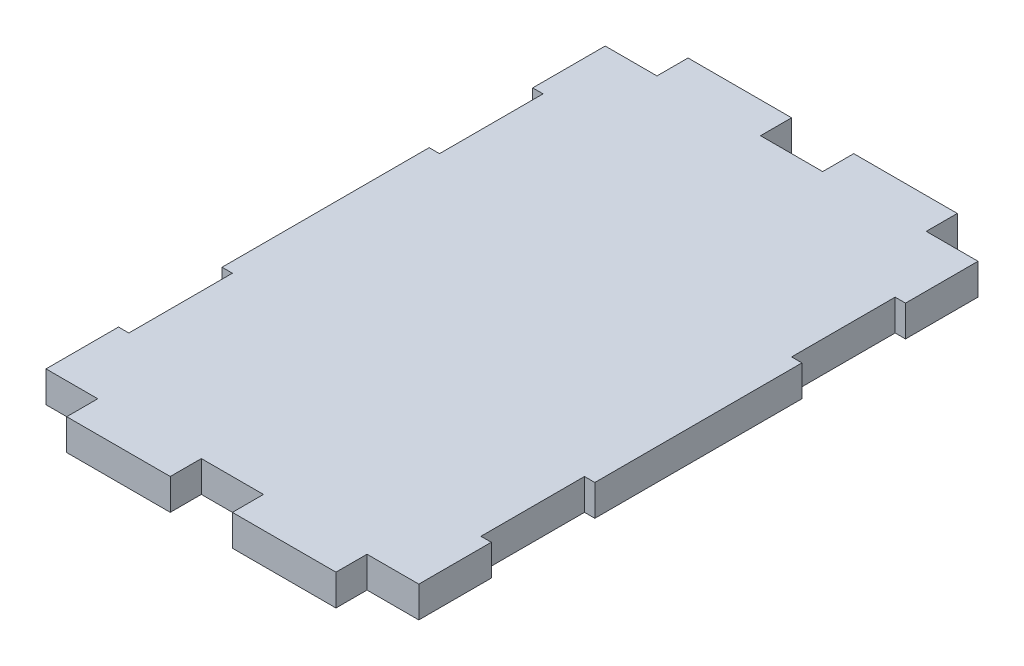
ISO-10303-21;
HEADER;
FILE_DESCRIPTION(('STEP AP214'),'2;1');
FILE_NAME('part.step','',(''),(''),'','','');
FILE_SCHEMA(('AUTOMOTIVE_DESIGN { 1 0 10303 214 1 1 1 1 }'));
ENDSEC;
DATA;
#1=APPLICATION_CONTEXT('core data for automotive mechanical design processes');
#2=APPLICATION_PROTOCOL_DEFINITION('international standard','automotive_design',2000,#1);
#3=PRODUCT_CONTEXT('',#1,'mechanical');
#4=PRODUCT('Part','Part','',(#3));
#5=PRODUCT_RELATED_PRODUCT_CATEGORY('part','',(#4));
#6=PRODUCT_DEFINITION_FORMATION('','',#4);
#7=PRODUCT_DEFINITION_CONTEXT('part definition',#1,'design');
#8=PRODUCT_DEFINITION('design','',#6,#7);
#9=PRODUCT_DEFINITION_SHAPE('','',#8);
#10=(LENGTH_UNIT() NAMED_UNIT(*) SI_UNIT(.MILLI.,.METRE.));
#11=(NAMED_UNIT(*) PLANE_ANGLE_UNIT() SI_UNIT($,.RADIAN.));
#12=(NAMED_UNIT(*) SI_UNIT($,.STERADIAN.) SOLID_ANGLE_UNIT());
#13=UNCERTAINTY_MEASURE_WITH_UNIT(LENGTH_MEASURE(1.E-05),#10,'distance_accuracy_value','');
#14=(GEOMETRIC_REPRESENTATION_CONTEXT(3) GLOBAL_UNCERTAINTY_ASSIGNED_CONTEXT((#13)) GLOBAL_UNIT_ASSIGNED_CONTEXT((#10,
#11,#12)) REPRESENTATION_CONTEXT('',''));
#15=CARTESIAN_POINT('',(0.,0.,0.));
#16=DIRECTION('',(0.,0.,1.));
#17=DIRECTION('',(1.,0.,0.));
#18=AXIS2_PLACEMENT_3D('',#15,#16,#17);
#19=CARTESIAN_POINT('',(0.,3.,-3.));
#20=DIRECTION('',(0.,0.,-1.));
#21=DIRECTION('',(-1.,0.,0.));
#22=AXIS2_PLACEMENT_3D('',#19,#20,#21);
#23=PLANE('',#22);
#24=DIRECTION('',(1.,0.,0.));
#25=VECTOR('',#24,1.);
#26=CARTESIAN_POINT('',(0.,0.,-3.));
#27=LINE('',#26,#25);
#28=CARTESIAN_POINT('',(0.,0.,-3.));
#29=VERTEX_POINT('',#28);
#30=CARTESIAN_POINT('',(5.,0.,-3.));
#31=VERTEX_POINT('',#30);
#32=EDGE_CURVE('E302',#29,#31,#27,.T.);
#33=ORIENTED_EDGE('',*,*,#32,.T.);
#34=DIRECTION('',(0.,-1.,0.));
#35=VECTOR('',#34,1.);
#36=CARTESIAN_POINT('',(5.,3.,-3.));
#37=LINE('',#36,#35);
#38=CARTESIAN_POINT('',(5.,3.,-3.));
#39=VERTEX_POINT('',#38);
#40=EDGE_CURVE('E11',#39,#31,#37,.T.);
#41=ORIENTED_EDGE('',*,*,#40,.F.);
#42=DIRECTION('',(1.,0.,0.));
#43=VECTOR('',#42,1.);
#44=CARTESIAN_POINT('',(0.,3.,-3.));
#45=LINE('',#44,#43);
#46=CARTESIAN_POINT('',(0.,3.,-3.));
#47=VERTEX_POINT('',#46);
#48=EDGE_CURVE('E391',#47,#39,#45,.T.);
#49=ORIENTED_EDGE('',*,*,#48,.F.);
#50=DIRECTION('',(0.,-1.,0.));
#51=VECTOR('',#50,1.);
#52=CARTESIAN_POINT('',(0.,3.,-3.));
#53=LINE('',#52,#51);
#54=EDGE_CURVE('E52',#47,#29,#53,.T.);
#55=ORIENTED_EDGE('',*,*,#54,.T.);
#56=EDGE_LOOP('',(#33,#41,#49,#55));
#57=FACE_BOUND('',#56,.T.);
#58=ADVANCED_FACE('F35',(#57),#23,.F.);
#59=CARTESIAN_POINT('',(5.,3.,0.));
#60=DIRECTION('',(1.,0.,0.));
#61=DIRECTION('',(0.,0.,-1.));
#62=AXIS2_PLACEMENT_3D('',#59,#60,#61);
#63=PLANE('',#62);
#64=DIRECTION('',(0.,0.,1.));
#65=VECTOR('',#64,1.);
#66=CARTESIAN_POINT('',(5.,0.,0.));
#67=LINE('',#66,#65);
#68=CARTESIAN_POINT('',(5.,0.,0.));
#69=VERTEX_POINT('',#68);
#70=EDGE_CURVE('E304',#31,#69,#67,.T.);
#71=ORIENTED_EDGE('',*,*,#70,.T.);
#72=DIRECTION('',(0.,-1.,0.));
#73=VECTOR('',#72,1.);
#74=CARTESIAN_POINT('',(5.,3.,0.));
#75=LINE('',#74,#73);
#76=CARTESIAN_POINT('',(5.,3.,0.));
#77=VERTEX_POINT('',#76);
#78=EDGE_CURVE('E44',#77,#69,#75,.T.);
#79=ORIENTED_EDGE('',*,*,#78,.F.);
#80=DIRECTION('',(0.,0.,1.));
#81=VECTOR('',#80,1.);
#82=CARTESIAN_POINT('',(5.,3.,0.));
#83=LINE('',#82,#81);
#84=EDGE_CURVE('E174',#39,#77,#83,.T.);
#85=ORIENTED_EDGE('',*,*,#84,.F.);
#86=ORIENTED_EDGE('',*,*,#40,.T.);
#87=EDGE_LOOP('',(#71,#79,#85,#86));
#88=FACE_BOUND('',#87,.T.);
#89=ADVANCED_FACE('F37',(#88),#63,.F.);
#90=CARTESIAN_POINT('',(0.,3.,0.));
#91=DIRECTION('',(0.,0.,-1.));
#92=DIRECTION('',(-1.,0.,0.));
#93=AXIS2_PLACEMENT_3D('',#90,#91,#92);
#94=PLANE('',#93);
#95=DIRECTION('',(1.,0.,0.));
#96=VECTOR('',#95,1.);
#97=CARTESIAN_POINT('',(0.,0.,0.));
#98=LINE('',#97,#96);
#99=CARTESIAN_POINT('',(15.,0.,0.));
#100=VERTEX_POINT('',#99);
#101=EDGE_CURVE('E307',#69,#100,#98,.T.);
#102=ORIENTED_EDGE('',*,*,#101,.T.);
#103=DIRECTION('',(0.,-1.,0.));
#104=VECTOR('',#103,1.);
#105=CARTESIAN_POINT('',(15.,3.,0.));
#106=LINE('',#105,#104);
#107=CARTESIAN_POINT('',(15.,3.,0.));
#108=VERTEX_POINT('',#107);
#109=EDGE_CURVE('E459',#108,#100,#106,.T.);
#110=ORIENTED_EDGE('',*,*,#109,.F.);
#111=DIRECTION('',(1.,0.,0.));
#112=VECTOR('',#111,1.);
#113=CARTESIAN_POINT('',(0.,3.,0.));
#114=LINE('',#113,#112);
#115=EDGE_CURVE('E466',#77,#108,#114,.T.);
#116=ORIENTED_EDGE('',*,*,#115,.F.);
#117=ORIENTED_EDGE('',*,*,#78,.T.);
#118=EDGE_LOOP('',(#102,#110,#116,#117));
#119=FACE_BOUND('',#118,.T.);
#120=ADVANCED_FACE('F464',(#119),#94,.F.);
#121=CARTESIAN_POINT('',(15.,3.,0.));
#122=DIRECTION('',(1.,0.,0.));
#123=DIRECTION('',(0.,0.,-1.));
#124=AXIS2_PLACEMENT_3D('',#121,#122,#123);
#125=PLANE('',#124);
#126=DIRECTION('',(0.,0.,1.));
#127=VECTOR('',#126,1.);
#128=CARTESIAN_POINT('',(15.,0.,0.));
#129=LINE('',#128,#127);
#130=CARTESIAN_POINT('',(15.,0.,-3.));
#131=VERTEX_POINT('',#130);
#132=EDGE_CURVE('E310',#131,#100,#129,.T.);
#133=ORIENTED_EDGE('',*,*,#132,.F.);
#134=DIRECTION('',(0.,-1.,0.));
#135=VECTOR('',#134,1.);
#136=CARTESIAN_POINT('',(15.,3.,-3.));
#137=LINE('',#136,#135);
#138=CARTESIAN_POINT('',(15.,3.,-3.));
#139=VERTEX_POINT('',#138);
#140=EDGE_CURVE('E457',#139,#131,#137,.T.);
#141=ORIENTED_EDGE('',*,*,#140,.F.);
#142=DIRECTION('',(0.,0.,1.));
#143=VECTOR('',#142,1.);
#144=CARTESIAN_POINT('',(15.,3.,0.));
#145=LINE('',#144,#143);
#146=EDGE_CURVE('E477',#139,#108,#145,.T.);
#147=ORIENTED_EDGE('',*,*,#146,.T.);
#148=ORIENTED_EDGE('',*,*,#109,.T.);
#149=EDGE_LOOP('',(#133,#141,#147,#148));
#150=FACE_BOUND('',#149,.T.);
#151=ADVANCED_FACE('F473',(#150),#125,.T.);
#152=CARTESIAN_POINT('',(21.,0.,-3.));
#153=VERTEX_POINT('',#152);
#154=EDGE_CURVE('E305',#131,#153,#27,.T.);
#155=ORIENTED_EDGE('',*,*,#154,.T.);
#156=DIRECTION('',(0.,-1.,0.));
#157=VECTOR('',#156,1.);
#158=CARTESIAN_POINT('',(21.,3.,-3.));
#159=LINE('',#158,#157);
#160=CARTESIAN_POINT('',(21.,3.,-3.));
#161=VERTEX_POINT('',#160);
#162=EDGE_CURVE('E454',#161,#153,#159,.T.);
#163=ORIENTED_EDGE('',*,*,#162,.F.);
#164=EDGE_CURVE('E478',#139,#161,#45,.T.);
#165=ORIENTED_EDGE('',*,*,#164,.F.);
#166=ORIENTED_EDGE('',*,*,#140,.T.);
#167=EDGE_LOOP('',(#155,#163,#165,#166));
#168=FACE_BOUND('',#167,.T.);
#169=ADVANCED_FACE('F566',(#168),#23,.F.);
#170=CARTESIAN_POINT('',(21.,3.,0.));
#171=DIRECTION('',(1.,0.,0.));
#172=DIRECTION('',(0.,0.,-1.));
#173=AXIS2_PLACEMENT_3D('',#170,#171,#172);
#174=PLANE('',#173);
#175=DIRECTION('',(0.,0.,1.));
#176=VECTOR('',#175,1.);
#177=CARTESIAN_POINT('',(21.,0.,0.));
#178=LINE('',#177,#176);
#179=CARTESIAN_POINT('',(21.,0.,0.));
#180=VERTEX_POINT('',#179);
#181=EDGE_CURVE('E313',#153,#180,#178,.T.);
#182=ORIENTED_EDGE('',*,*,#181,.T.);
#183=DIRECTION('',(0.,-1.,0.));
#184=VECTOR('',#183,1.);
#185=CARTESIAN_POINT('',(21.,3.,0.));
#186=LINE('',#185,#184);
#187=CARTESIAN_POINT('',(21.,3.,0.));
#188=VERTEX_POINT('',#187);
#189=EDGE_CURVE('E451',#188,#180,#186,.T.);
#190=ORIENTED_EDGE('',*,*,#189,.F.);
#191=DIRECTION('',(0.,0.,1.));
#192=VECTOR('',#191,1.);
#193=CARTESIAN_POINT('',(21.,3.,0.));
#194=LINE('',#193,#192);
#195=EDGE_CURVE('E480',#161,#188,#194,.T.);
#196=ORIENTED_EDGE('',*,*,#195,.F.);
#197=ORIENTED_EDGE('',*,*,#162,.T.);
#198=EDGE_LOOP('',(#182,#190,#196,#197));
#199=FACE_BOUND('',#198,.T.);
#200=ADVANCED_FACE('F573',(#199),#174,.F.);
#201=CARTESIAN_POINT('',(0.,3.,0.));
#202=DIRECTION('',(0.,0.,-1.));
#203=DIRECTION('',(-1.,0.,0.));
#204=AXIS2_PLACEMENT_3D('',#201,#202,#203);
#205=PLANE('',#204);
#206=DIRECTION('',(1.,0.,0.));
#207=VECTOR('',#206,1.);
#208=CARTESIAN_POINT('',(0.,0.,0.));
#209=LINE('',#208,#207);
#210=CARTESIAN_POINT('',(31.,0.,0.));
#211=VERTEX_POINT('',#210);
#212=EDGE_CURVE('E315',#180,#211,#209,.T.);
#213=ORIENTED_EDGE('',*,*,#212,.T.);
#214=DIRECTION('',(0.,-1.,0.));
#215=VECTOR('',#214,1.);
#216=CARTESIAN_POINT('',(31.,3.,0.));
#217=LINE('',#216,#215);
#218=CARTESIAN_POINT('',(31.,3.,0.));
#219=VERTEX_POINT('',#218);
#220=EDGE_CURVE('E449',#219,#211,#217,.T.);
#221=ORIENTED_EDGE('',*,*,#220,.F.);
#222=DIRECTION('',(1.,0.,0.));
#223=VECTOR('',#222,1.);
#224=CARTESIAN_POINT('',(0.,3.,0.));
#225=LINE('',#224,#223);
#226=EDGE_CURVE('E486',#188,#219,#225,.T.);
#227=ORIENTED_EDGE('',*,*,#226,.F.);
#228=ORIENTED_EDGE('',*,*,#189,.T.);
#229=EDGE_LOOP('',(#213,#221,#227,#228));
#230=FACE_BOUND('',#229,.T.);
#231=ADVANCED_FACE('F579',(#230),#205,.F.);
#232=CARTESIAN_POINT('',(31.,3.,0.));
#233=DIRECTION('',(1.,0.,0.));
#234=DIRECTION('',(0.,0.,-1.));
#235=AXIS2_PLACEMENT_3D('',#232,#233,#234);
#236=PLANE('',#235);
#237=DIRECTION('',(0.,0.,1.));
#238=VECTOR('',#237,1.);
#239=CARTESIAN_POINT('',(31.,0.,0.));
#240=LINE('',#239,#238);
#241=CARTESIAN_POINT('',(31.,0.,-3.));
#242=VERTEX_POINT('',#241);
#243=EDGE_CURVE('E318',#242,#211,#240,.T.);
#244=ORIENTED_EDGE('',*,*,#243,.F.);
#245=DIRECTION('',(0.,-1.,0.));
#246=VECTOR('',#245,1.);
#247=CARTESIAN_POINT('',(31.,3.,-3.));
#248=LINE('',#247,#246);
#249=CARTESIAN_POINT('',(31.,3.,-3.));
#250=VERTEX_POINT('',#249);
#251=EDGE_CURVE('E447',#250,#242,#248,.T.);
#252=ORIENTED_EDGE('',*,*,#251,.F.);
#253=DIRECTION('',(0.,0.,1.));
#254=VECTOR('',#253,1.);
#255=CARTESIAN_POINT('',(31.,3.,0.));
#256=LINE('',#255,#254);
#257=EDGE_CURVE('E488',#250,#219,#256,.T.);
#258=ORIENTED_EDGE('',*,*,#257,.T.);
#259=ORIENTED_EDGE('',*,*,#220,.T.);
#260=EDGE_LOOP('',(#244,#252,#258,#259));
#261=FACE_BOUND('',#260,.T.);
#262=ADVANCED_FACE('F743',(#261),#236,.T.);
#263=CARTESIAN_POINT('',(0.,3.,-3.));
#264=DIRECTION('',(0.,0.,1.));
#265=DIRECTION('',(1.,0.,0.));
#266=AXIS2_PLACEMENT_3D('',#263,#264,#265);
#267=PLANE('',#266);
#268=DIRECTION('',(-1.,0.,0.));
#269=VECTOR('',#268,1.);
#270=CARTESIAN_POINT('',(0.,0.,-3.));
#271=LINE('',#270,#269);
#272=CARTESIAN_POINT('',(36.,0.,-3.));
#273=VERTEX_POINT('',#272);
#274=EDGE_CURVE('E321',#273,#242,#271,.T.);
#275=ORIENTED_EDGE('',*,*,#274,.F.);
#276=DIRECTION('',(0.,-1.,0.));
#277=VECTOR('',#276,1.);
#278=CARTESIAN_POINT('',(36.,3.,-3.));
#279=LINE('',#278,#277);
#280=CARTESIAN_POINT('',(36.,3.,-3.));
#281=VERTEX_POINT('',#280);
#282=EDGE_CURVE('E445',#281,#273,#279,.T.);
#283=ORIENTED_EDGE('',*,*,#282,.F.);
#284=DIRECTION('',(-1.,0.,0.));
#285=VECTOR('',#284,1.);
#286=CARTESIAN_POINT('',(0.,3.,-3.));
#287=LINE('',#286,#285);
#288=EDGE_CURVE('E491',#281,#250,#287,.T.);
#289=ORIENTED_EDGE('',*,*,#288,.T.);
#290=ORIENTED_EDGE('',*,*,#251,.T.);
#291=EDGE_LOOP('',(#275,#283,#289,#290));
#292=FACE_BOUND('',#291,.T.);
#293=ADVANCED_FACE('F594',(#292),#267,.T.);
#294=CARTESIAN_POINT('',(36.,3.,0.));
#295=DIRECTION('',(-1.,0.,0.));
#296=DIRECTION('',(0.,0.,1.));
#297=AXIS2_PLACEMENT_3D('',#294,#295,#296);
#298=PLANE('',#297);
#299=DIRECTION('',(0.,0.,-1.));
#300=VECTOR('',#299,1.);
#301=CARTESIAN_POINT('',(36.,0.,0.));
#302=LINE('',#301,#300);
#303=CARTESIAN_POINT('',(36.,0.,-10.));
#304=VERTEX_POINT('',#303);
#305=EDGE_CURVE('E324',#273,#304,#302,.T.);
#306=ORIENTED_EDGE('',*,*,#305,.T.);
#307=DIRECTION('',(0.,-1.,0.));
#308=VECTOR('',#307,1.);
#309=CARTESIAN_POINT('',(36.,3.,-10.));
#310=LINE('',#309,#308);
#311=CARTESIAN_POINT('',(36.,3.,-10.));
#312=VERTEX_POINT('',#311);
#313=EDGE_CURVE('E442',#312,#304,#310,.T.);
#314=ORIENTED_EDGE('',*,*,#313,.F.);
#315=DIRECTION('',(0.,0.,-1.));
#316=VECTOR('',#315,1.);
#317=CARTESIAN_POINT('',(36.,3.,0.));
#318=LINE('',#317,#316);
#319=EDGE_CURVE('E494',#281,#312,#318,.T.);
#320=ORIENTED_EDGE('',*,*,#319,.F.);
#321=ORIENTED_EDGE('',*,*,#282,.T.);
#322=EDGE_LOOP('',(#306,#314,#320,#321));
#323=FACE_BOUND('',#322,.T.);
#324=ADVANCED_FACE('F599',(#323),#298,.F.);
#325=CARTESIAN_POINT('',(0.,3.,-10.));
#326=DIRECTION('',(0.,0.,1.));
#327=DIRECTION('',(1.,0.,0.));
#328=AXIS2_PLACEMENT_3D('',#325,#326,#327);
#329=PLANE('',#328);
#330=DIRECTION('',(-1.,0.,0.));
#331=VECTOR('',#330,1.);
#332=CARTESIAN_POINT('',(0.,0.,-10.));
#333=LINE('',#332,#331);
#334=CARTESIAN_POINT('',(35.,0.,-10.));
#335=VERTEX_POINT('',#334);
#336=EDGE_CURVE('E326',#304,#335,#333,.T.);
#337=ORIENTED_EDGE('',*,*,#336,.T.);
#338=DIRECTION('',(0.,-1.,0.));
#339=VECTOR('',#338,1.);
#340=CARTESIAN_POINT('',(35.,3.,-10.));
#341=LINE('',#340,#339);
#342=CARTESIAN_POINT('',(35.,3.,-10.));
#343=VERTEX_POINT('',#342);
#344=EDGE_CURVE('E439',#343,#335,#341,.T.);
#345=ORIENTED_EDGE('',*,*,#344,.F.);
#346=DIRECTION('',(-1.,0.,0.));
#347=VECTOR('',#346,1.);
#348=CARTESIAN_POINT('',(0.,3.,-10.));
#349=LINE('',#348,#347);
#350=EDGE_CURVE('E496',#312,#343,#349,.T.);
#351=ORIENTED_EDGE('',*,*,#350,.F.);
#352=ORIENTED_EDGE('',*,*,#313,.T.);
#353=EDGE_LOOP('',(#337,#345,#351,#352));
#354=FACE_BOUND('',#353,.T.);
#355=ADVANCED_FACE('F606',(#354),#329,.F.);
#356=CARTESIAN_POINT('',(35.,3.,0.));
#357=DIRECTION('',(-1.,0.,0.));
#358=DIRECTION('',(0.,0.,1.));
#359=AXIS2_PLACEMENT_3D('',#356,#357,#358);
#360=PLANE('',#359);
#361=DIRECTION('',(0.,0.,-1.));
#362=VECTOR('',#361,1.);
#363=CARTESIAN_POINT('',(35.,0.,0.));
#364=LINE('',#363,#362);
#365=CARTESIAN_POINT('',(35.,0.,-20.));
#366=VERTEX_POINT('',#365);
#367=EDGE_CURVE('E328',#335,#366,#364,.T.);
#368=ORIENTED_EDGE('',*,*,#367,.T.);
#369=DIRECTION('',(0.,-1.,0.));
#370=VECTOR('',#369,1.);
#371=CARTESIAN_POINT('',(35.,3.,-20.));
#372=LINE('',#371,#370);
#373=CARTESIAN_POINT('',(35.,3.,-20.));
#374=VERTEX_POINT('',#373);
#375=EDGE_CURVE('E437',#374,#366,#372,.T.);
#376=ORIENTED_EDGE('',*,*,#375,.F.);
#377=DIRECTION('',(0.,0.,-1.));
#378=VECTOR('',#377,1.);
#379=CARTESIAN_POINT('',(35.,3.,0.));
#380=LINE('',#379,#378);
#381=EDGE_CURVE('E498',#343,#374,#380,.T.);
#382=ORIENTED_EDGE('',*,*,#381,.F.);
#383=ORIENTED_EDGE('',*,*,#344,.T.);
#384=EDGE_LOOP('',(#368,#376,#382,#383));
#385=FACE_BOUND('',#384,.T.);
#386=ADVANCED_FACE('F610',(#385),#360,.F.);
#387=CARTESIAN_POINT('',(0.,3.,-20.));
#388=DIRECTION('',(0.,0.,1.));
#389=DIRECTION('',(1.,0.,0.));
#390=AXIS2_PLACEMENT_3D('',#387,#388,#389);
#391=PLANE('',#390);
#392=DIRECTION('',(-1.,0.,0.));
#393=VECTOR('',#392,1.);
#394=CARTESIAN_POINT('',(0.,0.,-20.));
#395=LINE('',#394,#393);
#396=CARTESIAN_POINT('',(36.,0.,-20.));
#397=VERTEX_POINT('',#396);
#398=EDGE_CURVE('E331',#397,#366,#395,.T.);
#399=ORIENTED_EDGE('',*,*,#398,.F.);
#400=DIRECTION('',(0.,-1.,0.));
#401=VECTOR('',#400,1.);
#402=CARTESIAN_POINT('',(36.,3.,-20.));
#403=LINE('',#402,#401);
#404=CARTESIAN_POINT('',(36.,3.,-20.));
#405=VERTEX_POINT('',#404);
#406=EDGE_CURVE('E435',#405,#397,#403,.T.);
#407=ORIENTED_EDGE('',*,*,#406,.F.);
#408=DIRECTION('',(-1.,0.,0.));
#409=VECTOR('',#408,1.);
#410=CARTESIAN_POINT('',(0.,3.,-20.));
#411=LINE('',#410,#409);
#412=EDGE_CURVE('E500',#405,#374,#411,.T.);
#413=ORIENTED_EDGE('',*,*,#412,.T.);
#414=ORIENTED_EDGE('',*,*,#375,.T.);
#415=EDGE_LOOP('',(#399,#407,#413,#414));
#416=FACE_BOUND('',#415,.T.);
#417=ADVANCED_FACE('F613',(#416),#391,.T.);
#418=CARTESIAN_POINT('',(36.,3.,0.));
#419=DIRECTION('',(1.,0.,0.));
#420=DIRECTION('',(0.,0.,-1.));
#421=AXIS2_PLACEMENT_3D('',#418,#419,#420);
#422=PLANE('',#421);
#423=DIRECTION('',(0.,0.,1.));
#424=VECTOR('',#423,1.);
#425=CARTESIAN_POINT('',(36.,0.,0.));
#426=LINE('',#425,#424);
#427=CARTESIAN_POINT('',(36.,0.,-40.));
#428=VERTEX_POINT('',#427);
#429=EDGE_CURVE('E335',#428,#397,#426,.T.);
#430=ORIENTED_EDGE('',*,*,#429,.F.);
#431=DIRECTION('',(0.,-1.,0.));
#432=VECTOR('',#431,1.);
#433=CARTESIAN_POINT('',(36.,3.,-40.));
#434=LINE('',#433,#432);
#435=CARTESIAN_POINT('',(36.,3.,-40.));
#436=VERTEX_POINT('',#435);
#437=EDGE_CURVE('E433',#436,#428,#434,.T.);
#438=ORIENTED_EDGE('',*,*,#437,.F.);
#439=DIRECTION('',(0.,0.,1.));
#440=VECTOR('',#439,1.);
#441=CARTESIAN_POINT('',(36.,3.,0.));
#442=LINE('',#441,#440);
#443=EDGE_CURVE('E504',#436,#405,#442,.T.);
#444=ORIENTED_EDGE('',*,*,#443,.T.);
#445=ORIENTED_EDGE('',*,*,#406,.T.);
#446=EDGE_LOOP('',(#430,#438,#444,#445));
#447=FACE_BOUND('',#446,.T.);
#448=ADVANCED_FACE('F617',(#447),#422,.T.);
#449=CARTESIAN_POINT('',(0.,3.,-40.));
#450=DIRECTION('',(0.,0.,1.));
#451=DIRECTION('',(1.,0.,0.));
#452=AXIS2_PLACEMENT_3D('',#449,#450,#451);
#453=PLANE('',#452);
#454=DIRECTION('',(-1.,0.,0.));
#455=VECTOR('',#454,1.);
#456=CARTESIAN_POINT('',(0.,0.,-40.));
#457=LINE('',#456,#455);
#458=CARTESIAN_POINT('',(35.,0.,-40.));
#459=VERTEX_POINT('',#458);
#460=EDGE_CURVE('E338',#428,#459,#457,.T.);
#461=ORIENTED_EDGE('',*,*,#460,.T.);
#462=DIRECTION('',(0.,-1.,0.));
#463=VECTOR('',#462,1.);
#464=CARTESIAN_POINT('',(35.,3.,-40.));
#465=LINE('',#464,#463);
#466=CARTESIAN_POINT('',(35.,3.,-40.));
#467=VERTEX_POINT('',#466);
#468=EDGE_CURVE('E430',#467,#459,#465,.T.);
#469=ORIENTED_EDGE('',*,*,#468,.F.);
#470=DIRECTION('',(-1.,0.,0.));
#471=VECTOR('',#470,1.);
#472=CARTESIAN_POINT('',(0.,3.,-40.));
#473=LINE('',#472,#471);
#474=EDGE_CURVE('E507',#436,#467,#473,.T.);
#475=ORIENTED_EDGE('',*,*,#474,.F.);
#476=ORIENTED_EDGE('',*,*,#437,.T.);
#477=EDGE_LOOP('',(#461,#469,#475,#476));
#478=FACE_BOUND('',#477,.T.);
#479=ADVANCED_FACE('F622',(#478),#453,.F.);
#480=CARTESIAN_POINT('',(35.,0.,-50.));
#481=VERTEX_POINT('',#480);
#482=EDGE_CURVE('E332',#459,#481,#364,.T.);
#483=ORIENTED_EDGE('',*,*,#482,.T.);
#484=DIRECTION('',(0.,-1.,0.));
#485=VECTOR('',#484,1.);
#486=CARTESIAN_POINT('',(35.,3.,-50.));
#487=LINE('',#486,#485);
#488=CARTESIAN_POINT('',(35.,3.,-50.));
#489=VERTEX_POINT('',#488);
#490=EDGE_CURVE('E428',#489,#481,#487,.T.);
#491=ORIENTED_EDGE('',*,*,#490,.F.);
#492=EDGE_CURVE('E501',#467,#489,#380,.T.);
#493=ORIENTED_EDGE('',*,*,#492,.F.);
#494=ORIENTED_EDGE('',*,*,#468,.T.);
#495=EDGE_LOOP('',(#483,#491,#493,#494));
#496=FACE_BOUND('',#495,.T.);
#497=ADVANCED_FACE('F628',(#496),#360,.F.);
#498=CARTESIAN_POINT('',(0.,3.,-50.));
#499=DIRECTION('',(0.,0.,1.));
#500=DIRECTION('',(1.,0.,0.));
#501=AXIS2_PLACEMENT_3D('',#498,#499,#500);
#502=PLANE('',#501);
#503=DIRECTION('',(-1.,0.,0.));
#504=VECTOR('',#503,1.);
#505=CARTESIAN_POINT('',(0.,0.,-50.));
#506=LINE('',#505,#504);
#507=CARTESIAN_POINT('',(36.,0.,-50.));
#508=VERTEX_POINT('',#507);
#509=EDGE_CURVE('E340',#508,#481,#506,.T.);
#510=ORIENTED_EDGE('',*,*,#509,.F.);
#511=DIRECTION('',(0.,-1.,0.));
#512=VECTOR('',#511,1.);
#513=CARTESIAN_POINT('',(36.,3.,-50.));
#514=LINE('',#513,#512);
#515=CARTESIAN_POINT('',(36.,3.,-50.));
#516=VERTEX_POINT('',#515);
#517=EDGE_CURVE('E426',#516,#508,#514,.T.);
#518=ORIENTED_EDGE('',*,*,#517,.F.);
#519=DIRECTION('',(-1.,0.,0.));
#520=VECTOR('',#519,1.);
#521=CARTESIAN_POINT('',(0.,3.,-50.));
#522=LINE('',#521,#520);
#523=EDGE_CURVE('E509',#516,#489,#522,.T.);
#524=ORIENTED_EDGE('',*,*,#523,.T.);
#525=ORIENTED_EDGE('',*,*,#490,.T.);
#526=EDGE_LOOP('',(#510,#518,#524,#525));
#527=FACE_BOUND('',#526,.T.);
#528=ADVANCED_FACE('F632',(#527),#502,.T.);
#529=CARTESIAN_POINT('',(36.,3.,0.));
#530=DIRECTION('',(-1.,0.,0.));
#531=DIRECTION('',(0.,0.,1.));
#532=AXIS2_PLACEMENT_3D('',#529,#530,#531);
#533=PLANE('',#532);
#534=DIRECTION('',(0.,0.,-1.));
#535=VECTOR('',#534,1.);
#536=CARTESIAN_POINT('',(36.,0.,0.));
#537=LINE('',#536,#535);
#538=CARTESIAN_POINT('',(36.,0.,-57.));
#539=VERTEX_POINT('',#538);
#540=EDGE_CURVE('E343',#508,#539,#537,.T.);
#541=ORIENTED_EDGE('',*,*,#540,.T.);
#542=DIRECTION('',(0.,-1.,0.));
#543=VECTOR('',#542,1.);
#544=CARTESIAN_POINT('',(36.,3.,-57.));
#545=LINE('',#544,#543);
#546=CARTESIAN_POINT('',(36.,3.,-57.));
#547=VERTEX_POINT('',#546);
#548=EDGE_CURVE('E424',#547,#539,#545,.T.);
#549=ORIENTED_EDGE('',*,*,#548,.F.);
#550=DIRECTION('',(0.,0.,-1.));
#551=VECTOR('',#550,1.);
#552=CARTESIAN_POINT('',(36.,3.,0.));
#553=LINE('',#552,#551);
#554=EDGE_CURVE('E512',#516,#547,#553,.T.);
#555=ORIENTED_EDGE('',*,*,#554,.F.);
#556=ORIENTED_EDGE('',*,*,#517,.T.);
#557=EDGE_LOOP('',(#541,#549,#555,#556));
#558=FACE_BOUND('',#557,.T.);
#559=ADVANCED_FACE('F637',(#558),#533,.F.);
#560=CARTESIAN_POINT('',(0.,3.,-57.));
#561=DIRECTION('',(0.,0.,-1.));
#562=DIRECTION('',(-1.,0.,0.));
#563=AXIS2_PLACEMENT_3D('',#560,#561,#562);
#564=PLANE('',#563);
#565=DIRECTION('',(1.,0.,0.));
#566=VECTOR('',#565,1.);
#567=CARTESIAN_POINT('',(0.,0.,-57.));
#568=LINE('',#567,#566);
#569=CARTESIAN_POINT('',(31.,0.,-57.));
#570=VERTEX_POINT('',#569);
#571=EDGE_CURVE('E346',#570,#539,#568,.T.);
#572=ORIENTED_EDGE('',*,*,#571,.F.);
#573=DIRECTION('',(0.,-1.,0.));
#574=VECTOR('',#573,1.);
#575=CARTESIAN_POINT('',(31.,3.,-57.));
#576=LINE('',#575,#574);
#577=CARTESIAN_POINT('',(31.,3.,-57.));
#578=VERTEX_POINT('',#577);
#579=EDGE_CURVE('E422',#578,#570,#576,.T.);
#580=ORIENTED_EDGE('',*,*,#579,.F.);
#581=DIRECTION('',(1.,0.,0.));
#582=VECTOR('',#581,1.);
#583=CARTESIAN_POINT('',(0.,3.,-57.));
#584=LINE('',#583,#582);
#585=EDGE_CURVE('E514',#578,#547,#584,.T.);
#586=ORIENTED_EDGE('',*,*,#585,.T.);
#587=ORIENTED_EDGE('',*,*,#548,.T.);
#588=EDGE_LOOP('',(#572,#580,#586,#587));
#589=FACE_BOUND('',#588,.T.);
#590=ADVANCED_FACE('F644',(#589),#564,.T.);
#591=CARTESIAN_POINT('',(31.,3.,0.));
#592=DIRECTION('',(-1.,0.,0.));
#593=DIRECTION('',(0.,0.,1.));
#594=AXIS2_PLACEMENT_3D('',#591,#592,#593);
#595=PLANE('',#594);
#596=DIRECTION('',(0.,0.,-1.));
#597=VECTOR('',#596,1.);
#598=CARTESIAN_POINT('',(31.,0.,0.));
#599=LINE('',#598,#597);
#600=CARTESIAN_POINT('',(31.,0.,-60.));
#601=VERTEX_POINT('',#600);
#602=EDGE_CURVE('E349',#570,#601,#599,.T.);
#603=ORIENTED_EDGE('',*,*,#602,.T.);
#604=DIRECTION('',(0.,-1.,0.));
#605=VECTOR('',#604,1.);
#606=CARTESIAN_POINT('',(31.,3.,-60.));
#607=LINE('',#606,#605);
#608=CARTESIAN_POINT('',(31.,3.,-60.));
#609=VERTEX_POINT('',#608);
#610=EDGE_CURVE('E420',#609,#601,#607,.T.);
#611=ORIENTED_EDGE('',*,*,#610,.F.);
#612=DIRECTION('',(0.,0.,-1.));
#613=VECTOR('',#612,1.);
#614=CARTESIAN_POINT('',(31.,3.,0.));
#615=LINE('',#614,#613);
#616=EDGE_CURVE('E517',#578,#609,#615,.T.);
#617=ORIENTED_EDGE('',*,*,#616,.F.);
#618=ORIENTED_EDGE('',*,*,#579,.T.);
#619=EDGE_LOOP('',(#603,#611,#617,#618));
#620=FACE_BOUND('',#619,.T.);
#621=ADVANCED_FACE('F647',(#620),#595,.F.);
#622=CARTESIAN_POINT('',(0.,3.,-60.));
#623=DIRECTION('',(0.,0.,-1.));
#624=DIRECTION('',(-1.,0.,0.));
#625=AXIS2_PLACEMENT_3D('',#622,#623,#624);
#626=PLANE('',#625);
#627=DIRECTION('',(1.,0.,0.));
#628=VECTOR('',#627,1.);
#629=CARTESIAN_POINT('',(0.,0.,-60.));
#630=LINE('',#629,#628);
#631=CARTESIAN_POINT('',(21.,0.,-60.));
#632=VERTEX_POINT('',#631);
#633=EDGE_CURVE('E354',#632,#601,#630,.T.);
#634=ORIENTED_EDGE('',*,*,#633,.F.);
#635=DIRECTION('',(0.,-1.,0.));
#636=VECTOR('',#635,1.);
#637=CARTESIAN_POINT('',(21.,3.,-60.));
#638=LINE('',#637,#636);
#639=CARTESIAN_POINT('',(21.,3.,-60.));
#640=VERTEX_POINT('',#639);
#641=EDGE_CURVE('E418',#640,#632,#638,.T.);
#642=ORIENTED_EDGE('',*,*,#641,.F.);
#643=DIRECTION('',(1.,0.,0.));
#644=VECTOR('',#643,1.);
#645=CARTESIAN_POINT('',(0.,3.,-60.));
#646=LINE('',#645,#644);
#647=EDGE_CURVE('E521',#640,#609,#646,.T.);
#648=ORIENTED_EDGE('',*,*,#647,.T.);
#649=ORIENTED_EDGE('',*,*,#610,.T.);
#650=EDGE_LOOP('',(#634,#642,#648,#649));
#651=FACE_BOUND('',#650,.T.);
#652=ADVANCED_FACE('F650',(#651),#626,.T.);
#653=CARTESIAN_POINT('',(21.,3.,0.));
#654=DIRECTION('',(-1.,0.,0.));
#655=DIRECTION('',(0.,0.,1.));
#656=AXIS2_PLACEMENT_3D('',#653,#654,#655);
#657=PLANE('',#656);
#658=DIRECTION('',(0.,0.,-1.));
#659=VECTOR('',#658,1.);
#660=CARTESIAN_POINT('',(21.,0.,0.));
#661=LINE('',#660,#659);
#662=CARTESIAN_POINT('',(21.,0.,-57.));
#663=VERTEX_POINT('',#662);
#664=EDGE_CURVE('E357',#663,#632,#661,.T.);
#665=ORIENTED_EDGE('',*,*,#664,.F.);
#666=DIRECTION('',(0.,-1.,0.));
#667=VECTOR('',#666,1.);
#668=CARTESIAN_POINT('',(21.,3.,-57.));
#669=LINE('',#668,#667);
#670=CARTESIAN_POINT('',(21.,3.,-57.));
#671=VERTEX_POINT('',#670);
#672=EDGE_CURVE('E416',#671,#663,#669,.T.);
#673=ORIENTED_EDGE('',*,*,#672,.F.);
#674=DIRECTION('',(0.,0.,-1.));
#675=VECTOR('',#674,1.);
#676=CARTESIAN_POINT('',(21.,3.,0.));
#677=LINE('',#676,#675);
#678=EDGE_CURVE('E524',#671,#640,#677,.T.);
#679=ORIENTED_EDGE('',*,*,#678,.T.);
#680=ORIENTED_EDGE('',*,*,#641,.T.);
#681=EDGE_LOOP('',(#665,#673,#679,#680));
#682=FACE_BOUND('',#681,.T.);
#683=ADVANCED_FACE('F656',(#682),#657,.T.);
#684=CARTESIAN_POINT('',(15.,0.,-57.));
#685=VERTEX_POINT('',#684);
#686=EDGE_CURVE('E351',#685,#663,#568,.T.);
#687=ORIENTED_EDGE('',*,*,#686,.F.);
#688=DIRECTION('',(0.,-1.,0.));
#689=VECTOR('',#688,1.);
#690=CARTESIAN_POINT('',(15.,3.,-57.));
#691=LINE('',#690,#689);
#692=CARTESIAN_POINT('',(15.,3.,-57.));
#693=VERTEX_POINT('',#692);
#694=EDGE_CURVE('E414',#693,#685,#691,.T.);
#695=ORIENTED_EDGE('',*,*,#694,.F.);
#696=EDGE_CURVE('E519',#693,#671,#584,.T.);
#697=ORIENTED_EDGE('',*,*,#696,.T.);
#698=ORIENTED_EDGE('',*,*,#672,.T.);
#699=EDGE_LOOP('',(#687,#695,#697,#698));
#700=FACE_BOUND('',#699,.T.);
#701=ADVANCED_FACE('F660',(#700),#564,.T.);
#702=CARTESIAN_POINT('',(15.,3.,0.));
#703=DIRECTION('',(-1.,0.,0.));
#704=DIRECTION('',(0.,0.,1.));
#705=AXIS2_PLACEMENT_3D('',#702,#703,#704);
#706=PLANE('',#705);
#707=DIRECTION('',(0.,0.,-1.));
#708=VECTOR('',#707,1.);
#709=CARTESIAN_POINT('',(15.,0.,0.));
#710=LINE('',#709,#708);
#711=CARTESIAN_POINT('',(15.,0.,-60.));
#712=VERTEX_POINT('',#711);
#713=EDGE_CURVE('E360',#685,#712,#710,.T.);
#714=ORIENTED_EDGE('',*,*,#713,.T.);
#715=DIRECTION('',(0.,-1.,0.));
#716=VECTOR('',#715,1.);
#717=CARTESIAN_POINT('',(15.,3.,-60.));
#718=LINE('',#717,#716);
#719=CARTESIAN_POINT('',(15.,3.,-60.));
#720=VERTEX_POINT('',#719);
#721=EDGE_CURVE('E412',#720,#712,#718,.T.);
#722=ORIENTED_EDGE('',*,*,#721,.F.);
#723=DIRECTION('',(0.,0.,-1.));
#724=VECTOR('',#723,1.);
#725=CARTESIAN_POINT('',(15.,3.,0.));
#726=LINE('',#725,#724);
#727=EDGE_CURVE('E527',#693,#720,#726,.T.);
#728=ORIENTED_EDGE('',*,*,#727,.F.);
#729=ORIENTED_EDGE('',*,*,#694,.T.);
#730=EDGE_LOOP('',(#714,#722,#728,#729));
#731=FACE_BOUND('',#730,.T.);
#732=ADVANCED_FACE('F714',(#731),#706,.F.);
#733=CARTESIAN_POINT('',(0.,3.,-60.));
#734=DIRECTION('',(0.,0.,-1.));
#735=DIRECTION('',(-1.,0.,0.));
#736=AXIS2_PLACEMENT_3D('',#733,#734,#735);
#737=PLANE('',#736);
#738=DIRECTION('',(1.,0.,0.));
#739=VECTOR('',#738,1.);
#740=CARTESIAN_POINT('',(0.,0.,-60.));
#741=LINE('',#740,#739);
#742=CARTESIAN_POINT('',(5.,0.,-60.));
#743=VERTEX_POINT('',#742);
#744=EDGE_CURVE('E363',#743,#712,#741,.T.);
#745=ORIENTED_EDGE('',*,*,#744,.F.);
#746=DIRECTION('',(0.,-1.,0.));
#747=VECTOR('',#746,1.);
#748=CARTESIAN_POINT('',(5.,3.,-60.));
#749=LINE('',#748,#747);
#750=CARTESIAN_POINT('',(5.,3.,-60.));
#751=VERTEX_POINT('',#750);
#752=EDGE_CURVE('E410',#751,#743,#749,.T.);
#753=ORIENTED_EDGE('',*,*,#752,.F.);
#754=DIRECTION('',(1.,0.,0.));
#755=VECTOR('',#754,1.);
#756=CARTESIAN_POINT('',(0.,3.,-60.));
#757=LINE('',#756,#755);
#758=EDGE_CURVE('E529',#751,#720,#757,.T.);
#759=ORIENTED_EDGE('',*,*,#758,.T.);
#760=ORIENTED_EDGE('',*,*,#721,.T.);
#761=EDGE_LOOP('',(#745,#753,#759,#760));
#762=FACE_BOUND('',#761,.T.);
#763=ADVANCED_FACE('F710',(#762),#737,.T.);
#764=CARTESIAN_POINT('',(4.99999999999998,3.,0.));
#765=DIRECTION('',(-1.,0.,0.));
#766=DIRECTION('',(0.,0.,1.));
#767=AXIS2_PLACEMENT_3D('',#764,#765,#766);
#768=PLANE('',#767);
#769=DIRECTION('',(0.,0.,-1.));
#770=VECTOR('',#769,1.);
#771=CARTESIAN_POINT('',(4.99999999999998,0.,0.));
#772=LINE('',#771,#770);
#773=CARTESIAN_POINT('',(5.,0.,-57.));
#774=VERTEX_POINT('',#773);
#775=EDGE_CURVE('E366',#774,#743,#772,.T.);
#776=ORIENTED_EDGE('',*,*,#775,.F.);
#777=DIRECTION('',(0.,-1.,0.));
#778=VECTOR('',#777,1.);
#779=CARTESIAN_POINT('',(5.,3.,-57.));
#780=LINE('',#779,#778);
#781=CARTESIAN_POINT('',(5.,3.,-57.));
#782=VERTEX_POINT('',#781);
#783=EDGE_CURVE('E408',#782,#774,#780,.T.);
#784=ORIENTED_EDGE('',*,*,#783,.F.);
#785=DIRECTION('',(0.,0.,-1.));
#786=VECTOR('',#785,1.);
#787=CARTESIAN_POINT('',(4.99999999999998,3.,0.));
#788=LINE('',#787,#786);
#789=EDGE_CURVE('E532',#782,#751,#788,.T.);
#790=ORIENTED_EDGE('',*,*,#789,.T.);
#791=ORIENTED_EDGE('',*,*,#752,.T.);
#792=EDGE_LOOP('',(#776,#784,#790,#791));
#793=FACE_BOUND('',#792,.T.);
#794=ADVANCED_FACE('F707',(#793),#768,.T.);
#795=CARTESIAN_POINT('',(0.,0.,-57.));
#796=VERTEX_POINT('',#795);
#797=EDGE_CURVE('E350',#796,#774,#568,.T.);
#798=ORIENTED_EDGE('',*,*,#797,.F.);
#799=DIRECTION('',(0.,-1.,0.));
#800=VECTOR('',#799,1.);
#801=CARTESIAN_POINT('',(0.,3.,-57.));
#802=LINE('',#801,#800);
#803=CARTESIAN_POINT('',(0.,3.,-57.));
#804=VERTEX_POINT('',#803);
#805=EDGE_CURVE('E406',#804,#796,#802,.T.);
#806=ORIENTED_EDGE('',*,*,#805,.F.);
#807=EDGE_CURVE('E518',#804,#782,#584,.T.);
#808=ORIENTED_EDGE('',*,*,#807,.T.);
#809=ORIENTED_EDGE('',*,*,#783,.T.);
#810=EDGE_LOOP('',(#798,#806,#808,#809));
#811=FACE_BOUND('',#810,.T.);
#812=ADVANCED_FACE('F666',(#811),#564,.T.);
#813=CARTESIAN_POINT('',(0.,3.,0.));
#814=DIRECTION('',(-1.,0.,0.));
#815=DIRECTION('',(0.,0.,1.));
#816=AXIS2_PLACEMENT_3D('',#813,#814,#815);
#817=PLANE('',#816);
#818=DIRECTION('',(0.,0.,-1.));
#819=VECTOR('',#818,1.);
#820=CARTESIAN_POINT('',(0.,0.,0.));
#821=LINE('',#820,#819);
#822=CARTESIAN_POINT('',(0.,0.,-50.));
#823=VERTEX_POINT('',#822);
#824=EDGE_CURVE('E369',#823,#796,#821,.T.);
#825=ORIENTED_EDGE('',*,*,#824,.F.);
#826=DIRECTION('',(0.,-1.,0.));
#827=VECTOR('',#826,1.);
#828=CARTESIAN_POINT('',(0.,3.,-50.));
#829=LINE('',#828,#827);
#830=CARTESIAN_POINT('',(0.,3.,-50.));
#831=VERTEX_POINT('',#830);
#832=EDGE_CURVE('E404',#831,#823,#829,.T.);
#833=ORIENTED_EDGE('',*,*,#832,.F.);
#834=DIRECTION('',(0.,0.,-1.));
#835=VECTOR('',#834,1.);
#836=CARTESIAN_POINT('',(0.,3.,0.));
#837=LINE('',#836,#835);
#838=EDGE_CURVE('E535',#831,#804,#837,.T.);
#839=ORIENTED_EDGE('',*,*,#838,.T.);
#840=ORIENTED_EDGE('',*,*,#805,.T.);
#841=EDGE_LOOP('',(#825,#833,#839,#840));
#842=FACE_BOUND('',#841,.T.);
#843=ADVANCED_FACE('F673',(#842),#817,.T.);
#844=CARTESIAN_POINT('',(0.,3.,-50.));
#845=DIRECTION('',(0.,0.,-1.));
#846=DIRECTION('',(-1.,0.,0.));
#847=AXIS2_PLACEMENT_3D('',#844,#845,#846);
#848=PLANE('',#847);
#849=DIRECTION('',(1.,0.,0.));
#850=VECTOR('',#849,1.);
#851=CARTESIAN_POINT('',(0.,0.,-50.));
#852=LINE('',#851,#850);
#853=CARTESIAN_POINT('',(1.,0.,-50.));
#854=VERTEX_POINT('',#853);
#855=EDGE_CURVE('E372',#823,#854,#852,.T.);
#856=ORIENTED_EDGE('',*,*,#855,.T.);
#857=DIRECTION('',(0.,-1.,0.));
#858=VECTOR('',#857,1.);
#859=CARTESIAN_POINT('',(1.,3.,-50.));
#860=LINE('',#859,#858);
#861=CARTESIAN_POINT('',(1.,3.,-50.));
#862=VERTEX_POINT('',#861);
#863=EDGE_CURVE('E402',#862,#854,#860,.T.);
#864=ORIENTED_EDGE('',*,*,#863,.F.);
#865=DIRECTION('',(1.,0.,0.));
#866=VECTOR('',#865,1.);
#867=CARTESIAN_POINT('',(0.,3.,-50.));
#868=LINE('',#867,#866);
#869=EDGE_CURVE('E538',#831,#862,#868,.T.);
#870=ORIENTED_EDGE('',*,*,#869,.F.);
#871=ORIENTED_EDGE('',*,*,#832,.T.);
#872=EDGE_LOOP('',(#856,#864,#870,#871));
#873=FACE_BOUND('',#872,.T.);
#874=ADVANCED_FACE('F678',(#873),#848,.F.);
#875=CARTESIAN_POINT('',(1.,3.,0.));
#876=DIRECTION('',(-1.,0.,0.));
#877=DIRECTION('',(0.,0.,1.));
#878=AXIS2_PLACEMENT_3D('',#875,#876,#877);
#879=PLANE('',#878);
#880=DIRECTION('',(0.,0.,-1.));
#881=VECTOR('',#880,1.);
#882=CARTESIAN_POINT('',(1.,0.,0.));
#883=LINE('',#882,#881);
#884=CARTESIAN_POINT('',(1.,0.,-40.));
#885=VERTEX_POINT('',#884);
#886=EDGE_CURVE('E375',#885,#854,#883,.T.);
#887=ORIENTED_EDGE('',*,*,#886,.F.);
#888=DIRECTION('',(0.,-1.,0.));
#889=VECTOR('',#888,1.);
#890=CARTESIAN_POINT('',(1.,3.,-40.));
#891=LINE('',#890,#889);
#892=CARTESIAN_POINT('',(1.,3.,-40.));
#893=VERTEX_POINT('',#892);
#894=EDGE_CURVE('E400',#893,#885,#891,.T.);
#895=ORIENTED_EDGE('',*,*,#894,.F.);
#896=DIRECTION('',(0.,0.,-1.));
#897=VECTOR('',#896,1.);
#898=CARTESIAN_POINT('',(1.,3.,0.));
#899=LINE('',#898,#897);
#900=EDGE_CURVE('E294',#893,#862,#899,.T.);
#901=ORIENTED_EDGE('',*,*,#900,.T.);
#902=ORIENTED_EDGE('',*,*,#863,.T.);
#903=EDGE_LOOP('',(#887,#895,#901,#902));
#904=FACE_BOUND('',#903,.T.);
#905=ADVANCED_FACE('F684',(#904),#879,.T.);
#906=CARTESIAN_POINT('',(0.,3.,-40.));
#907=DIRECTION('',(0.,0.,-1.));
#908=DIRECTION('',(-1.,0.,0.));
#909=AXIS2_PLACEMENT_3D('',#906,#907,#908);
#910=PLANE('',#909);
#911=DIRECTION('',(1.,0.,0.));
#912=VECTOR('',#911,1.);
#913=CARTESIAN_POINT('',(0.,0.,-40.));
#914=LINE('',#913,#912);
#915=CARTESIAN_POINT('',(0.,0.,-40.));
#916=VERTEX_POINT('',#915);
#917=EDGE_CURVE('E378',#916,#885,#914,.T.);
#918=ORIENTED_EDGE('',*,*,#917,.F.);
#919=DIRECTION('',(0.,-1.,0.));
#920=VECTOR('',#919,1.);
#921=CARTESIAN_POINT('',(0.,3.,-40.));
#922=LINE('',#921,#920);
#923=CARTESIAN_POINT('',(0.,3.,-40.));
#924=VERTEX_POINT('',#923);
#925=EDGE_CURVE('E398',#924,#916,#922,.T.);
#926=ORIENTED_EDGE('',*,*,#925,.F.);
#927=DIRECTION('',(1.,0.,0.));
#928=VECTOR('',#927,1.);
#929=CARTESIAN_POINT('',(0.,3.,-40.));
#930=LINE('',#929,#928);
#931=EDGE_CURVE('E541',#924,#893,#930,.T.);
#932=ORIENTED_EDGE('',*,*,#931,.T.);
#933=ORIENTED_EDGE('',*,*,#894,.T.);
#934=EDGE_LOOP('',(#918,#926,#932,#933));
#935=FACE_BOUND('',#934,.T.);
#936=ADVANCED_FACE('F682',(#935),#910,.T.);
#937=CARTESIAN_POINT('',(0.,3.,0.));
#938=DIRECTION('',(1.,0.,0.));
#939=DIRECTION('',(0.,0.,-1.));
#940=AXIS2_PLACEMENT_3D('',#937,#938,#939);
#941=PLANE('',#940);
#942=DIRECTION('',(0.,0.,1.));
#943=VECTOR('',#942,1.);
#944=CARTESIAN_POINT('',(0.,0.,0.));
#945=LINE('',#944,#943);
#946=CARTESIAN_POINT('',(0.,0.,-20.));
#947=VERTEX_POINT('',#946);
#948=EDGE_CURVE('E381',#916,#947,#945,.T.);
#949=ORIENTED_EDGE('',*,*,#948,.T.);
#950=DIRECTION('',(0.,-1.,0.));
#951=VECTOR('',#950,1.);
#952=CARTESIAN_POINT('',(0.,3.,-20.));
#953=LINE('',#952,#951);
#954=CARTESIAN_POINT('',(0.,3.,-20.));
#955=VERTEX_POINT('',#954);
#956=EDGE_CURVE('E395',#955,#947,#953,.T.);
#957=ORIENTED_EDGE('',*,*,#956,.F.);
#958=DIRECTION('',(0.,0.,1.));
#959=VECTOR('',#958,1.);
#960=CARTESIAN_POINT('',(0.,3.,0.));
#961=LINE('',#960,#959);
#962=EDGE_CURVE('E543',#924,#955,#961,.T.);
#963=ORIENTED_EDGE('',*,*,#962,.F.);
#964=ORIENTED_EDGE('',*,*,#925,.T.);
#965=EDGE_LOOP('',(#949,#957,#963,#964));
#966=FACE_BOUND('',#965,.T.);
#967=ADVANCED_FACE('F549',(#966),#941,.F.);
#968=CARTESIAN_POINT('',(0.,3.,-20.));
#969=DIRECTION('',(0.,0.,-1.));
#970=DIRECTION('',(-1.,0.,0.));
#971=AXIS2_PLACEMENT_3D('',#968,#969,#970);
#972=PLANE('',#971);
#973=DIRECTION('',(1.,0.,0.));
#974=VECTOR('',#973,1.);
#975=CARTESIAN_POINT('',(0.,0.,-20.));
#976=LINE('',#975,#974);
#977=CARTESIAN_POINT('',(1.,0.,-20.));
#978=VERTEX_POINT('',#977);
#979=EDGE_CURVE('E383',#947,#978,#976,.T.);
#980=ORIENTED_EDGE('',*,*,#979,.T.);
#981=DIRECTION('',(0.,-1.,0.));
#982=VECTOR('',#981,1.);
#983=CARTESIAN_POINT('',(1.,3.,-20.));
#984=LINE('',#983,#982);
#985=CARTESIAN_POINT('',(1.,3.,-20.));
#986=VERTEX_POINT('',#985);
#987=EDGE_CURVE('E283',#986,#978,#984,.T.);
#988=ORIENTED_EDGE('',*,*,#987,.F.);
#989=DIRECTION('',(1.,0.,0.));
#990=VECTOR('',#989,1.);
#991=CARTESIAN_POINT('',(0.,3.,-20.));
#992=LINE('',#991,#990);
#993=EDGE_CURVE('E291',#955,#986,#992,.T.);
#994=ORIENTED_EDGE('',*,*,#993,.F.);
#995=ORIENTED_EDGE('',*,*,#956,.T.);
#996=EDGE_LOOP('',(#980,#988,#994,#995));
#997=FACE_BOUND('',#996,.T.);
#998=ADVANCED_FACE('F553',(#997),#972,.F.);
#999=CARTESIAN_POINT('',(1.,0.,-10.));
#1000=VERTEX_POINT('',#999);
#1001=EDGE_CURVE('E279',#1000,#978,#883,.T.);
#1002=ORIENTED_EDGE('',*,*,#1001,.F.);
#1003=DIRECTION('',(0.,-1.,0.));
#1004=VECTOR('',#1003,1.);
#1005=CARTESIAN_POINT('',(1.,3.,-10.));
#1006=LINE('',#1005,#1004);
#1007=CARTESIAN_POINT('',(1.,3.,-10.));
#1008=VERTEX_POINT('',#1007);
#1009=EDGE_CURVE('E274',#1008,#1000,#1006,.T.);
#1010=ORIENTED_EDGE('',*,*,#1009,.F.);
#1011=EDGE_CURVE('E277',#1008,#986,#899,.T.);
#1012=ORIENTED_EDGE('',*,*,#1011,.T.);
#1013=ORIENTED_EDGE('',*,*,#987,.T.);
#1014=EDGE_LOOP('',(#1002,#1010,#1012,#1013));
#1015=FACE_BOUND('',#1014,.T.);
#1016=ADVANCED_FACE('F276',(#1015),#879,.T.);
#1017=CARTESIAN_POINT('',(0.,3.,-10.));
#1018=DIRECTION('',(0.,0.,-1.));
#1019=DIRECTION('',(-1.,0.,0.));
#1020=AXIS2_PLACEMENT_3D('',#1017,#1018,#1019);
#1021=PLANE('',#1020);
#1022=DIRECTION('',(1.,0.,0.));
#1023=VECTOR('',#1022,1.);
#1024=CARTESIAN_POINT('',(0.,0.,-10.));
#1025=LINE('',#1024,#1023);
#1026=CARTESIAN_POINT('',(0.,0.,-10.));
#1027=VERTEX_POINT('',#1026);
#1028=EDGE_CURVE('E386',#1027,#1000,#1025,.T.);
#1029=ORIENTED_EDGE('',*,*,#1028,.F.);
#1030=DIRECTION('',(0.,-1.,0.));
#1031=VECTOR('',#1030,1.);
#1032=CARTESIAN_POINT('',(0.,3.,-10.));
#1033=LINE('',#1032,#1031);
#1034=CARTESIAN_POINT('',(0.,3.,-10.));
#1035=VERTEX_POINT('',#1034);
#1036=EDGE_CURVE('E162',#1035,#1027,#1033,.T.);
#1037=ORIENTED_EDGE('',*,*,#1036,.F.);
#1038=DIRECTION('',(1.,0.,0.));
#1039=VECTOR('',#1038,1.);
#1040=CARTESIAN_POINT('',(0.,3.,-10.));
#1041=LINE('',#1040,#1039);
#1042=EDGE_CURVE('E289',#1035,#1008,#1041,.T.);
#1043=ORIENTED_EDGE('',*,*,#1042,.T.);
#1044=ORIENTED_EDGE('',*,*,#1009,.T.);
#1045=EDGE_LOOP('',(#1029,#1037,#1043,#1044));
#1046=FACE_BOUND('',#1045,.T.);
#1047=ADVANCED_FACE('F295',(#1046),#1021,.T.);
#1048=CARTESIAN_POINT('',(0.,3.,0.));
#1049=DIRECTION('',(-1.,0.,0.));
#1050=DIRECTION('',(0.,0.,1.));
#1051=AXIS2_PLACEMENT_3D('',#1048,#1049,#1050);
#1052=PLANE('',#1051);
#1053=DIRECTION('',(0.,0.,-1.));
#1054=VECTOR('',#1053,1.);
#1055=CARTESIAN_POINT('',(0.,0.,0.));
#1056=LINE('',#1055,#1054);
#1057=EDGE_CURVE('E388',#29,#1027,#1056,.T.);
#1058=ORIENTED_EDGE('',*,*,#1057,.F.);
#1059=ORIENTED_EDGE('',*,*,#54,.F.);
#1060=DIRECTION('',(0.,0.,-1.));
#1061=VECTOR('',#1060,1.);
#1062=CARTESIAN_POINT('',(0.,3.,0.));
#1063=LINE('',#1062,#1061);
#1064=EDGE_CURVE('E296',#47,#1035,#1063,.T.);
#1065=ORIENTED_EDGE('',*,*,#1064,.T.);
#1066=ORIENTED_EDGE('',*,*,#1036,.T.);
#1067=EDGE_LOOP('',(#1058,#1059,#1065,#1066));
#1068=FACE_BOUND('',#1067,.T.);
#1069=ADVANCED_FACE('F554',(#1068),#1052,.T.);
#1070=CARTESIAN_POINT('',(0.,3.,0.));
#1071=DIRECTION('',(0.,1.,0.));
#1072=DIRECTION('',(0.,0.,1.));
#1073=AXIS2_PLACEMENT_3D('',#1070,#1071,#1072);
#1074=PLANE('',#1073);
#1075=ORIENTED_EDGE('',*,*,#48,.T.);
#1076=ORIENTED_EDGE('',*,*,#84,.T.);
#1077=ORIENTED_EDGE('',*,*,#115,.T.);
#1078=ORIENTED_EDGE('',*,*,#146,.F.);
#1079=ORIENTED_EDGE('',*,*,#164,.T.);
#1080=ORIENTED_EDGE('',*,*,#195,.T.);
#1081=ORIENTED_EDGE('',*,*,#226,.T.);
#1082=ORIENTED_EDGE('',*,*,#257,.F.);
#1083=ORIENTED_EDGE('',*,*,#288,.F.);
#1084=ORIENTED_EDGE('',*,*,#319,.T.);
#1085=ORIENTED_EDGE('',*,*,#350,.T.);
#1086=ORIENTED_EDGE('',*,*,#381,.T.);
#1087=ORIENTED_EDGE('',*,*,#412,.F.);
#1088=ORIENTED_EDGE('',*,*,#443,.F.);
#1089=ORIENTED_EDGE('',*,*,#474,.T.);
#1090=ORIENTED_EDGE('',*,*,#492,.T.);
#1091=ORIENTED_EDGE('',*,*,#523,.F.);
#1092=ORIENTED_EDGE('',*,*,#554,.T.);
#1093=ORIENTED_EDGE('',*,*,#585,.F.);
#1094=ORIENTED_EDGE('',*,*,#616,.T.);
#1095=ORIENTED_EDGE('',*,*,#647,.F.);
#1096=ORIENTED_EDGE('',*,*,#678,.F.);
#1097=ORIENTED_EDGE('',*,*,#696,.F.);
#1098=ORIENTED_EDGE('',*,*,#727,.T.);
#1099=ORIENTED_EDGE('',*,*,#758,.F.);
#1100=ORIENTED_EDGE('',*,*,#789,.F.);
#1101=ORIENTED_EDGE('',*,*,#807,.F.);
#1102=ORIENTED_EDGE('',*,*,#838,.F.);
#1103=ORIENTED_EDGE('',*,*,#869,.T.);
#1104=ORIENTED_EDGE('',*,*,#900,.F.);
#1105=ORIENTED_EDGE('',*,*,#931,.F.);
#1106=ORIENTED_EDGE('',*,*,#962,.T.);
#1107=ORIENTED_EDGE('',*,*,#993,.T.);
#1108=ORIENTED_EDGE('',*,*,#1011,.F.);
#1109=ORIENTED_EDGE('',*,*,#1042,.F.);
#1110=ORIENTED_EDGE('',*,*,#1064,.F.);
#1111=EDGE_LOOP('',(#1075,#1076,#1077,#1078,#1079,#1080,#1081,#1082,#1083,#1084,#1085,#1086,
#1087,#1088,#1089,#1090,#1091,#1092,#1093,#1094,#1095,#1096,#1097,#1098,#1099,#1100,#1101,#1102,
#1103,#1104,#1105,#1106,#1107,#1108,#1109,#1110));
#1112=FACE_BOUND('',#1111,.T.);
#1113=ADVANCED_FACE('F287',(#1112),#1074,.T.);
#1114=CARTESIAN_POINT('',(0.,0.,0.));
#1115=DIRECTION('',(0.,1.,0.));
#1116=DIRECTION('',(0.,0.,1.));
#1117=AXIS2_PLACEMENT_3D('',#1114,#1115,#1116);
#1118=PLANE('',#1117);
#1119=ORIENTED_EDGE('',*,*,#32,.F.);
#1120=ORIENTED_EDGE('',*,*,#1057,.T.);
#1121=ORIENTED_EDGE('',*,*,#1028,.T.);
#1122=ORIENTED_EDGE('',*,*,#1001,.T.);
#1123=ORIENTED_EDGE('',*,*,#979,.F.);
#1124=ORIENTED_EDGE('',*,*,#948,.F.);
#1125=ORIENTED_EDGE('',*,*,#917,.T.);
#1126=ORIENTED_EDGE('',*,*,#886,.T.);
#1127=ORIENTED_EDGE('',*,*,#855,.F.);
#1128=ORIENTED_EDGE('',*,*,#824,.T.);
#1129=ORIENTED_EDGE('',*,*,#797,.T.);
#1130=ORIENTED_EDGE('',*,*,#775,.T.);
#1131=ORIENTED_EDGE('',*,*,#744,.T.);
#1132=ORIENTED_EDGE('',*,*,#713,.F.);
#1133=ORIENTED_EDGE('',*,*,#686,.T.);
#1134=ORIENTED_EDGE('',*,*,#664,.T.);
#1135=ORIENTED_EDGE('',*,*,#633,.T.);
#1136=ORIENTED_EDGE('',*,*,#602,.F.);
#1137=ORIENTED_EDGE('',*,*,#571,.T.);
#1138=ORIENTED_EDGE('',*,*,#540,.F.);
#1139=ORIENTED_EDGE('',*,*,#509,.T.);
#1140=ORIENTED_EDGE('',*,*,#482,.F.);
#1141=ORIENTED_EDGE('',*,*,#460,.F.);
#1142=ORIENTED_EDGE('',*,*,#429,.T.);
#1143=ORIENTED_EDGE('',*,*,#398,.T.);
#1144=ORIENTED_EDGE('',*,*,#367,.F.);
#1145=ORIENTED_EDGE('',*,*,#336,.F.);
#1146=ORIENTED_EDGE('',*,*,#305,.F.);
#1147=ORIENTED_EDGE('',*,*,#274,.T.);
#1148=ORIENTED_EDGE('',*,*,#243,.T.);
#1149=ORIENTED_EDGE('',*,*,#212,.F.);
#1150=ORIENTED_EDGE('',*,*,#181,.F.);
#1151=ORIENTED_EDGE('',*,*,#154,.F.);
#1152=ORIENTED_EDGE('',*,*,#132,.T.);
#1153=ORIENTED_EDGE('',*,*,#101,.F.);
#1154=ORIENTED_EDGE('',*,*,#70,.F.);
#1155=EDGE_LOOP('',(#1119,#1120,#1121,#1122,#1123,#1124,#1125,#1126,#1127,#1128,#1129,#1130,
#1131,#1132,#1133,#1134,#1135,#1136,#1137,#1138,#1139,#1140,#1141,#1142,#1143,#1144,#1145,#1146,
#1147,#1148,#1149,#1150,#1151,#1152,#1153,#1154));
#1156=FACE_BOUND('',#1155,.T.);
#1157=ADVANCED_FACE('F468',(#1156),#1118,.F.);
#1158=CLOSED_SHELL('',(#58,#89,#120,#151,#169,#200,#231,#262,#293,#324,#355,#386,#417,#448,#479,
#497,#528,#559,#590,#621,#652,#683,#701,#732,#763,#794,#812,#843,#874,#905,#936,#967,#998,#1016,
#1047,#1069,#1113,#1157));
#1159=MANIFOLD_SOLID_BREP('B2',#1158);
#1160=ADVANCED_BREP_SHAPE_REPRESENTATION('',(#18,#1159),#14);
#1161=SHAPE_DEFINITION_REPRESENTATION(#9,#1160);
ENDSEC;
END-ISO-10303-21;
